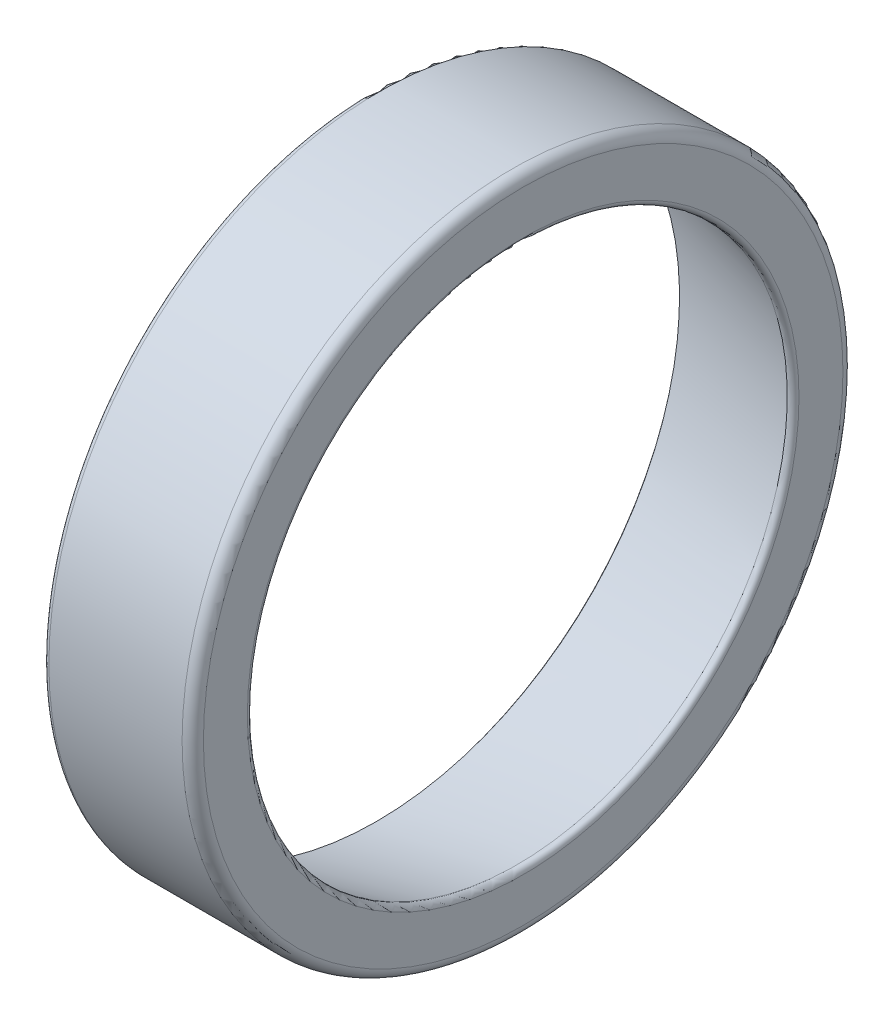
ISO-10303-21;
HEADER;
FILE_DESCRIPTION(('STEP AP214'),'2;1');
FILE_NAME('part.step','',(''),(''),'','','');
FILE_SCHEMA(('AUTOMOTIVE_DESIGN { 1 0 10303 214 1 1 1 1 }'));
ENDSEC;
DATA;
#1=APPLICATION_CONTEXT('core data for automotive mechanical design processes');
#2=APPLICATION_PROTOCOL_DEFINITION('international standard','automotive_design',2000,#1);
#3=PRODUCT_CONTEXT('',#1,'mechanical');
#4=PRODUCT('Part','Part','',(#3));
#5=PRODUCT_RELATED_PRODUCT_CATEGORY('part','',(#4));
#6=PRODUCT_DEFINITION_FORMATION('','',#4);
#7=PRODUCT_DEFINITION_CONTEXT('part definition',#1,'design');
#8=PRODUCT_DEFINITION('design','',#6,#7);
#9=PRODUCT_DEFINITION_SHAPE('','',#8);
#10=(LENGTH_UNIT() NAMED_UNIT(*) SI_UNIT(.MILLI.,.METRE.));
#11=(NAMED_UNIT(*) PLANE_ANGLE_UNIT() SI_UNIT($,.RADIAN.));
#12=(NAMED_UNIT(*) SI_UNIT($,.STERADIAN.) SOLID_ANGLE_UNIT());
#13=UNCERTAINTY_MEASURE_WITH_UNIT(LENGTH_MEASURE(1.E-05),#10,'distance_accuracy_value','');
#14=(GEOMETRIC_REPRESENTATION_CONTEXT(3) GLOBAL_UNCERTAINTY_ASSIGNED_CONTEXT((#13)) GLOBAL_UNIT_ASSIGNED_CONTEXT((#10,
#11,#12)) REPRESENTATION_CONTEXT('',''));
#15=CARTESIAN_POINT('',(0.,0.,0.));
#16=DIRECTION('',(0.,0.,1.));
#17=DIRECTION('',(1.,0.,0.));
#18=AXIS2_PLACEMENT_3D('',#15,#16,#17);
#19=CARTESIAN_POINT('',(-13.7564074846271,0.,0.));
#20=DIRECTION('',(-1.,0.,0.));
#21=DIRECTION('',(0.,0.,1.));
#22=AXIS2_PLACEMENT_3D('',#19,#20,#21);
#23=CONICAL_SURFACE('',#22,28.4259169086054,0.2268928025);
#24=CARTESIAN_POINT('',(-0.612475527171902,0.,0.));
#25=DIRECTION('',(-1.,0.,0.));
#26=DIRECTION('',(0.,0.,1.));
#27=AXIS2_PLACEMENT_3D('',#24,#25,#26);
#28=CIRCLE('',#27,25.3914011170669);
#29=CARTESIAN_POINT('',(-0.612475527171898,0.,25.3914011170669));
#30=VERTEX_POINT('',#29);
#31=EDGE_CURVE('E94',#30,#30,#28,.T.);
#32=ORIENTED_EDGE('',*,*,#31,.F.);
#33=EDGE_LOOP('',(#32));
#34=FACE_BOUND('',#33,.T.);
#35=CARTESIAN_POINT('',(-13.7564074836465,-1.7053022207375E-13,0.));
#36=DIRECTION('',(-1.,4.667091E-13,0.));
#37=DIRECTION('',(0.,0.,1.));
#38=AXIS2_PLACEMENT_3D('',#35,#36,#37);
#39=CIRCLE('',#38,28.425916912297);
#40=CARTESIAN_POINT('',(-13.7564074836465,-1.70530222073753E-13,28.425916912297));
#41=VERTEX_POINT('',#40);
#42=EDGE_CURVE('E97',#41,#41,#39,.T.);
#43=ORIENTED_EDGE('',*,*,#42,.T.);
#44=EDGE_LOOP('',(#43));
#45=FACE_BOUND('',#44,.T.);
#46=ADVANCED_FACE('F15',(#34,#45),#23,.F.);
#47=CARTESIAN_POINT('',(-14.0000000001572,0.,0.));
#48=DIRECTION('',(-1.,4.66734221029784E-13,0.));
#49=DIRECTION('',(-4.66734221029784E-13,-1.,0.));
#50=AXIS2_PLACEMENT_3D('',#47,#48,#49);
#51=CONICAL_SURFACE('',#50,28.7321546756327,0.898844563749959);
#52=CARTESIAN_POINT('',(-14.0000000001572,0.,0.));
#53=DIRECTION('',(-1.,4.66734221029784E-13,0.));
#54=DIRECTION('',(-4.66734221029784E-13,-1.,0.));
#55=AXIS2_PLACEMENT_3D('',#52,#53,#54);
#56=CIRCLE('',#55,28.7321546756327);
#57=CARTESIAN_POINT('',(-14.0000000001706,-28.7321546756328,0.));
#58=VERTEX_POINT('',#57);
#59=EDGE_CURVE('E18',#58,#58,#56,.T.);
#60=ORIENTED_EDGE('',*,*,#59,.T.);
#61=EDGE_LOOP('',(#60));
#62=FACE_BOUND('',#61,.T.);
#63=ORIENTED_EDGE('',*,*,#42,.F.);
#64=EDGE_LOOP('',(#63));
#65=FACE_BOUND('',#64,.T.);
#66=ADVANCED_FACE('F87',(#62,#65),#51,.F.);
#67=CARTESIAN_POINT('',(-0.5,0.,0.));
#68=DIRECTION('',(-1.,0.,0.));
#69=DIRECTION('',(0.,0.,1.));
#70=AXIS2_PLACEMENT_3D('',#67,#68,#69);
#71=TOROIDAL_SURFACE('',#70,25.8785861494595,0.5);
#72=CARTESIAN_POINT('',(0.,0.,0.));
#73=DIRECTION('',(1.,0.,0.));
#74=DIRECTION('',(0.,0.,-1.));
#75=AXIS2_PLACEMENT_3D('',#72,#73,#74);
#76=CIRCLE('',#75,25.8785861494595);
#77=CARTESIAN_POINT('',(0.,0.,-25.8785861494595));
#78=VERTEX_POINT('',#77);
#79=EDGE_CURVE('E102',#78,#78,#76,.F.);
#80=ORIENTED_EDGE('',*,*,#79,.F.);
#81=EDGE_LOOP('',(#80));
#82=FACE_BOUND('',#81,.T.);
#83=ORIENTED_EDGE('',*,*,#31,.T.);
#84=EDGE_LOOP('',(#83));
#85=FACE_BOUND('',#84,.T.);
#86=ADVANCED_FACE('F81',(#82,#85),#71,.T.);
#87=CARTESIAN_POINT('',(-14.,-1.136868E-13,0.));
#88=DIRECTION('',(1.,0.,0.));
#89=DIRECTION('',(0.,0.,-1.));
#90=AXIS2_PLACEMENT_3D('',#87,#88,#89);
#91=PLANE('',#90);
#92=ORIENTED_EDGE('',*,*,#59,.F.);
#93=EDGE_LOOP('',(#92));
#94=FACE_BOUND('',#93,.T.);
#95=CARTESIAN_POINT('',(-14.,0.,0.));
#96=DIRECTION('',(1.,0.,0.));
#97=DIRECTION('',(0.,0.,-1.));
#98=AXIS2_PLACEMENT_3D('',#95,#96,#97);
#99=CIRCLE('',#98,30.5);
#100=CARTESIAN_POINT('',(-14.,0.,-30.5));
#101=VERTEX_POINT('',#100);
#102=EDGE_CURVE('E65',#101,#101,#99,.T.);
#103=ORIENTED_EDGE('',*,*,#102,.F.);
#104=EDGE_LOOP('',(#103));
#105=FACE_BOUND('',#104,.T.);
#106=ADVANCED_FACE('F71',(#94,#105),#91,.F.);
#107=CARTESIAN_POINT('',(0.,0.,-31.));
#108=DIRECTION('',(1.,0.,0.));
#109=DIRECTION('',(0.,0.,-1.));
#110=AXIS2_PLACEMENT_3D('',#107,#108,#109);
#111=PLANE('',#110);
#112=ORIENTED_EDGE('',*,*,#79,.T.);
#113=EDGE_LOOP('',(#112));
#114=FACE_BOUND('',#113,.T.);
#115=CARTESIAN_POINT('',(0.,0.,0.));
#116=DIRECTION('',(-1.,0.,0.));
#117=DIRECTION('',(0.,0.,-1.));
#118=AXIS2_PLACEMENT_3D('',#115,#116,#117);
#119=CIRCLE('',#118,30.);
#120=CARTESIAN_POINT('',(0.,0.,-30.));
#121=VERTEX_POINT('',#120);
#122=EDGE_CURVE('E27',#121,#121,#119,.T.);
#123=ORIENTED_EDGE('',*,*,#122,.F.);
#124=EDGE_LOOP('',(#123));
#125=FACE_BOUND('',#124,.T.);
#126=ADVANCED_FACE('F80',(#114,#125),#111,.T.);
#127=CARTESIAN_POINT('',(-13.5,0.,0.));
#128=DIRECTION('',(1.,0.,0.));
#129=DIRECTION('',(0.,0.,-1.));
#130=AXIS2_PLACEMENT_3D('',#127,#128,#129);
#131=TOROIDAL_SURFACE('',#130,30.5,0.5);
#132=CARTESIAN_POINT('',(-13.5,0.,0.));
#133=DIRECTION('',(1.,0.,0.));
#134=DIRECTION('',(0.,0.,-1.));
#135=AXIS2_PLACEMENT_3D('',#132,#133,#134);
#136=CIRCLE('',#135,31.);
#137=CARTESIAN_POINT('',(-13.5,0.,-31.));
#138=VERTEX_POINT('',#137);
#139=EDGE_CURVE('E22',#138,#138,#136,.T.);
#140=ORIENTED_EDGE('',*,*,#139,.F.);
#141=EDGE_LOOP('',(#140));
#142=FACE_BOUND('',#141,.T.);
#143=ORIENTED_EDGE('',*,*,#102,.T.);
#144=EDGE_LOOP('',(#143));
#145=FACE_BOUND('',#144,.T.);
#146=ADVANCED_FACE('F45',(#142,#145),#131,.T.);
#147=CARTESIAN_POINT('',(-1.,0.,0.));
#148=DIRECTION('',(-1.,0.,0.));
#149=DIRECTION('',(0.,0.,1.));
#150=AXIS2_PLACEMENT_3D('',#147,#148,#149);
#151=TOROIDAL_SURFACE('',#150,30.,1.);
#152=CARTESIAN_POINT('',(-0.999999999999994,0.,0.));
#153=DIRECTION('',(1.,0.,0.));
#154=DIRECTION('',(0.,0.,-1.));
#155=AXIS2_PLACEMENT_3D('',#152,#153,#154);
#156=CIRCLE('',#155,31.);
#157=CARTESIAN_POINT('',(-1.,0.,-31.));
#158=VERTEX_POINT('',#157);
#159=EDGE_CURVE('E10',#158,#158,#156,.F.);
#160=ORIENTED_EDGE('',*,*,#159,.F.);
#161=EDGE_LOOP('',(#160));
#162=FACE_BOUND('',#161,.T.);
#163=ORIENTED_EDGE('',*,*,#122,.T.);
#164=EDGE_LOOP('',(#163));
#165=FACE_BOUND('',#164,.T.);
#166=ADVANCED_FACE('F39',(#162,#165),#151,.T.);
#167=CARTESIAN_POINT('',(-14.,0.,0.));
#168=DIRECTION('',(1.,0.,0.));
#169=DIRECTION('',(0.,0.,-1.));
#170=AXIS2_PLACEMENT_3D('',#167,#168,#169);
#171=CYLINDRICAL_SURFACE('',#170,31.);
#172=ORIENTED_EDGE('',*,*,#159,.T.);
#173=EDGE_LOOP('',(#172));
#174=FACE_BOUND('',#173,.T.);
#175=ORIENTED_EDGE('',*,*,#139,.T.);
#176=EDGE_LOOP('',(#175));
#177=FACE_BOUND('',#176,.T.);
#178=ADVANCED_FACE('F44',(#174,#177),#171,.T.);
#179=CLOSED_SHELL('',(#46,#66,#86,#106,#126,#146,#166,#178));
#180=MANIFOLD_SOLID_BREP('B1',#179);
#181=ADVANCED_BREP_SHAPE_REPRESENTATION('',(#18,#180),#14);
#182=SHAPE_DEFINITION_REPRESENTATION(#9,#181);
ENDSEC;
END-ISO-10303-21;
